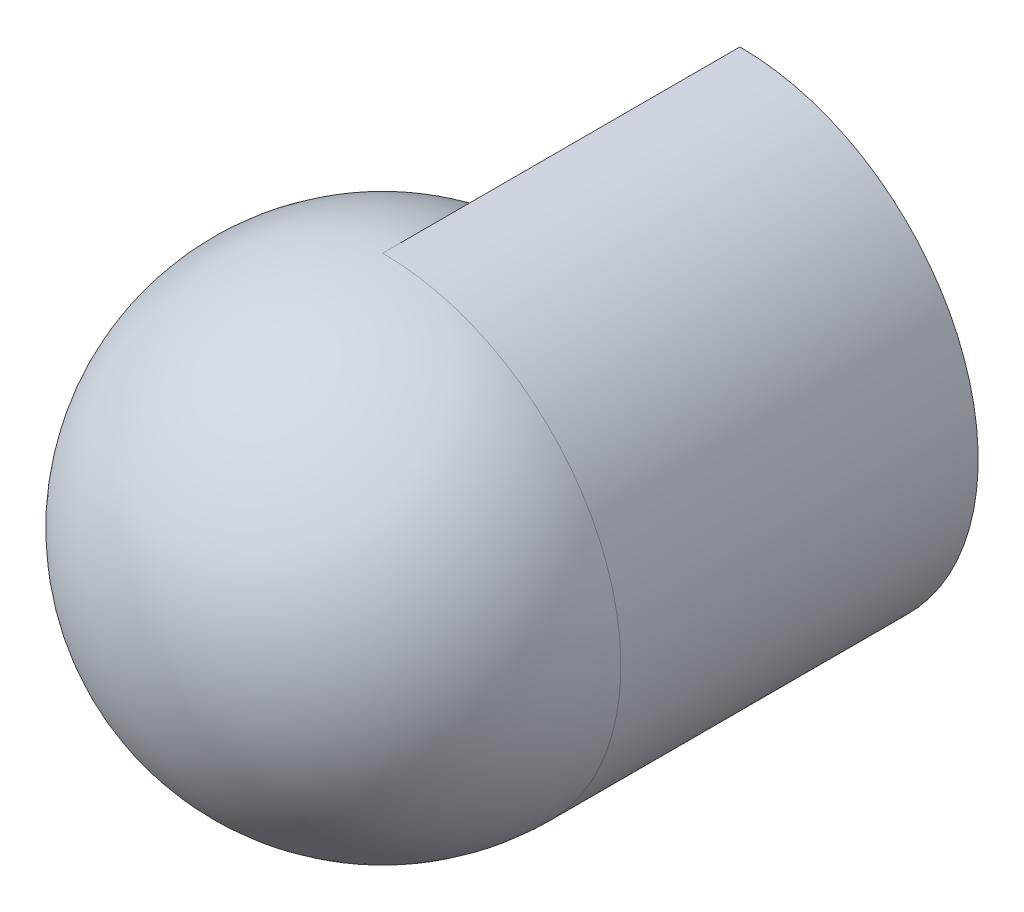
ISO-10303-21;
HEADER;
FILE_DESCRIPTION(('STEP AP214'),'2;1');
FILE_NAME('part.step','',(''),(''),'','','');
FILE_SCHEMA(('AUTOMOTIVE_DESIGN { 1 0 10303 214 1 1 1 1 }'));
ENDSEC;
DATA;
#1=APPLICATION_CONTEXT('core data for automotive mechanical design processes');
#2=APPLICATION_PROTOCOL_DEFINITION('international standard','automotive_design',2000,#1);
#3=PRODUCT_CONTEXT('',#1,'mechanical');
#4=PRODUCT('Part','Part','',(#3));
#5=PRODUCT_RELATED_PRODUCT_CATEGORY('part','',(#4));
#6=PRODUCT_DEFINITION_FORMATION('','',#4);
#7=PRODUCT_DEFINITION_CONTEXT('part definition',#1,'design');
#8=PRODUCT_DEFINITION('design','',#6,#7);
#9=PRODUCT_DEFINITION_SHAPE('','',#8);
#10=(LENGTH_UNIT() NAMED_UNIT(*) SI_UNIT(.MILLI.,.METRE.));
#11=(NAMED_UNIT(*) PLANE_ANGLE_UNIT() SI_UNIT($,.RADIAN.));
#12=(NAMED_UNIT(*) SI_UNIT($,.STERADIAN.) SOLID_ANGLE_UNIT());
#13=UNCERTAINTY_MEASURE_WITH_UNIT(LENGTH_MEASURE(1.E-05),#10,'distance_accuracy_value','');
#14=(GEOMETRIC_REPRESENTATION_CONTEXT(3) GLOBAL_UNCERTAINTY_ASSIGNED_CONTEXT((#13)) GLOBAL_UNIT_ASSIGNED_CONTEXT((#10,
#11,#12)) REPRESENTATION_CONTEXT('',''));
#15=CARTESIAN_POINT('',(0.,0.,0.));
#16=DIRECTION('',(0.,0.,1.));
#17=DIRECTION('',(1.,0.,0.));
#18=AXIS2_PLACEMENT_3D('',#15,#16,#17);
#19=CARTESIAN_POINT('',(0.,50.8,-76.2));
#20=DIRECTION('',(-1.,0.,0.));
#21=DIRECTION('',(0.,0.,1.));
#22=AXIS2_PLACEMENT_3D('',#19,#20,#21);
#23=PLANE('',#22);
#24=CARTESIAN_POINT('',(0.,0.,0.));
#25=DIRECTION('',(-1.,0.,0.));
#26=DIRECTION('',(0.,0.,1.));
#27=AXIS2_PLACEMENT_3D('',#24,#25,#26);
#28=CIRCLE('',#27,50.8);
#29=CARTESIAN_POINT('',(0.,50.8,0.));
#30=VERTEX_POINT('',#29);
#31=CARTESIAN_POINT('',(0.,-50.8,0.));
#32=VERTEX_POINT('',#31);
#33=EDGE_CURVE('E11',#30,#32,#28,.T.);
#34=ORIENTED_EDGE('',*,*,#33,.F.);
#35=DIRECTION('',(0.,0.,1.));
#36=VECTOR('',#35,1.);
#37=CARTESIAN_POINT('',(0.,50.8,-76.2));
#38=LINE('',#37,#36);
#39=CARTESIAN_POINT('',(0.,50.8,-76.2));
#40=VERTEX_POINT('',#39);
#41=EDGE_CURVE('E50',#40,#30,#38,.T.);
#42=ORIENTED_EDGE('',*,*,#41,.F.);
#43=DIRECTION('',(0.,-1.,0.));
#44=VECTOR('',#43,1.);
#45=CARTESIAN_POINT('',(0.,50.8,-76.2));
#46=LINE('',#45,#44);
#47=CARTESIAN_POINT('',(0.,-50.8,-76.2));
#48=VERTEX_POINT('',#47);
#49=EDGE_CURVE('E64',#40,#48,#46,.T.);
#50=ORIENTED_EDGE('',*,*,#49,.T.);
#51=DIRECTION('',(0.,0.,1.));
#52=VECTOR('',#51,1.);
#53=CARTESIAN_POINT('',(0.,-50.8,-76.2));
#54=LINE('',#53,#52);
#55=EDGE_CURVE('E56',#48,#32,#54,.T.);
#56=ORIENTED_EDGE('',*,*,#55,.T.);
#57=EDGE_LOOP('',(#34,#42,#50,#56));
#58=FACE_BOUND('',#57,.T.);
#59=ADVANCED_FACE('F35',(#58),#23,.T.);
#60=CARTESIAN_POINT('',(0.,0.,-76.2));
#61=DIRECTION('',(0.,0.,1.));
#62=DIRECTION('',(1.,0.,0.));
#63=AXIS2_PLACEMENT_3D('',#60,#61,#62);
#64=CYLINDRICAL_SURFACE('',#63,50.8);
#65=CARTESIAN_POINT('',(0.,0.,0.));
#66=DIRECTION('',(0.,0.,1.));
#67=DIRECTION('',(1.,0.,0.));
#68=AXIS2_PLACEMENT_3D('',#65,#66,#67);
#69=CIRCLE('',#68,50.8);
#70=EDGE_CURVE('E43',#32,#30,#69,.T.);
#71=ORIENTED_EDGE('',*,*,#70,.F.);
#72=ORIENTED_EDGE('',*,*,#55,.F.);
#73=CARTESIAN_POINT('',(0.,0.,-76.2));
#74=DIRECTION('',(0.,0.,1.));
#75=DIRECTION('',(1.,0.,0.));
#76=AXIS2_PLACEMENT_3D('',#73,#74,#75);
#77=CIRCLE('',#76,50.8);
#78=EDGE_CURVE('E100',#48,#40,#77,.T.);
#79=ORIENTED_EDGE('',*,*,#78,.T.);
#80=ORIENTED_EDGE('',*,*,#41,.T.);
#81=EDGE_LOOP('',(#71,#72,#79,#80));
#82=FACE_BOUND('',#81,.T.);
#83=ADVANCED_FACE('F66',(#82),#64,.T.);
#84=CARTESIAN_POINT('',(0.,0.,-76.2));
#85=DIRECTION('',(0.,0.,1.));
#86=DIRECTION('',(1.,0.,0.));
#87=AXIS2_PLACEMENT_3D('',#84,#85,#86);
#88=PLANE('',#87);
#89=ORIENTED_EDGE('',*,*,#78,.F.);
#90=ORIENTED_EDGE('',*,*,#49,.F.);
#91=EDGE_LOOP('',(#89,#90));
#92=FACE_BOUND('',#91,.T.);
#93=ADVANCED_FACE('F69',(#92),#88,.F.);
#94=CARTESIAN_POINT('',(0.,0.,0.));
#95=DIRECTION('',(0.,1.,0.));
#96=DIRECTION('',(1.,0.,0.));
#97=AXIS2_PLACEMENT_3D('',#94,#95,#96);
#98=SPHERICAL_SURFACE('',#97,50.8);
#99=ORIENTED_EDGE('',*,*,#70,.T.);
#100=ORIENTED_EDGE('',*,*,#33,.T.);
#101=EDGE_LOOP('',(#99,#100));
#102=FACE_BOUND('',#101,.T.);
#103=ADVANCED_FACE('F37',(#102),#98,.T.);
#104=CLOSED_SHELL('',(#59,#83,#93,#103));
#105=MANIFOLD_SOLID_BREP('B2',#104);
#106=ADVANCED_BREP_SHAPE_REPRESENTATION('',(#18,#105),#14);
#107=SHAPE_DEFINITION_REPRESENTATION(#9,#106);
ENDSEC;
END-ISO-10303-21;
